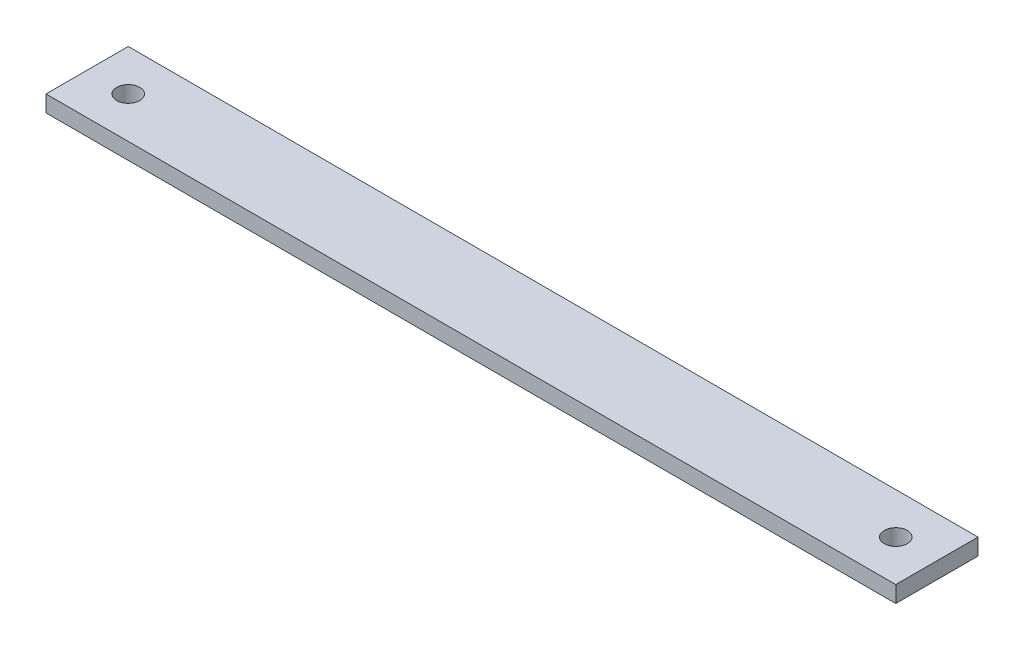
ISO-10303-21;
HEADER;
FILE_DESCRIPTION(('STEP AP214'),'2;1');
FILE_NAME('part.step','',(''),(''),'','','');
FILE_SCHEMA(('AUTOMOTIVE_DESIGN { 1 0 10303 214 1 1 1 1 }'));
ENDSEC;
DATA;
#1=APPLICATION_CONTEXT('core data for automotive mechanical design processes');
#2=APPLICATION_PROTOCOL_DEFINITION('international standard','automotive_design',2000,#1);
#3=PRODUCT_CONTEXT('',#1,'mechanical');
#4=PRODUCT('Part','Part','',(#3));
#5=PRODUCT_RELATED_PRODUCT_CATEGORY('part','',(#4));
#6=PRODUCT_DEFINITION_FORMATION('','',#4);
#7=PRODUCT_DEFINITION_CONTEXT('part definition',#1,'design');
#8=PRODUCT_DEFINITION('design','',#6,#7);
#9=PRODUCT_DEFINITION_SHAPE('','',#8);
#10=(LENGTH_UNIT() NAMED_UNIT(*) SI_UNIT(.MILLI.,.METRE.));
#11=(NAMED_UNIT(*) PLANE_ANGLE_UNIT() SI_UNIT($,.RADIAN.));
#12=(NAMED_UNIT(*) SI_UNIT($,.STERADIAN.) SOLID_ANGLE_UNIT());
#13=UNCERTAINTY_MEASURE_WITH_UNIT(LENGTH_MEASURE(1.E-05),#10,'distance_accuracy_value','');
#14=(GEOMETRIC_REPRESENTATION_CONTEXT(3) GLOBAL_UNCERTAINTY_ASSIGNED_CONTEXT((#13)) GLOBAL_UNIT_ASSIGNED_CONTEXT((#10,
#11,#12)) REPRESENTATION_CONTEXT('',''));
#15=CARTESIAN_POINT('',(0.,0.,0.));
#16=DIRECTION('',(0.,0.,1.));
#17=DIRECTION('',(1.,0.,0.));
#18=AXIS2_PLACEMENT_3D('',#15,#16,#17);
#19=CARTESIAN_POINT('',(-59.4117647058823,3.,-13.3823529411765));
#20=DIRECTION('',(1.,0.,0.));
#21=DIRECTION('',(0.,0.,-1.));
#22=AXIS2_PLACEMENT_3D('',#19,#20,#21);
#23=PLANE('',#22);
#24=DIRECTION('',(0.,0.,1.));
#25=VECTOR('',#24,1.);
#26=CARTESIAN_POINT('',(-59.4117647058823,0.,-13.3823529411765));
#27=LINE('',#26,#25);
#28=CARTESIAN_POINT('',(-59.4117647058823,0.,-13.3823529411765));
#29=VERTEX_POINT('',#28);
#30=CARTESIAN_POINT('',(-59.4117647058824,0.,1.61764705882353));
#31=VERTEX_POINT('',#30);
#32=EDGE_CURVE('E107',#29,#31,#27,.T.);
#33=ORIENTED_EDGE('',*,*,#32,.T.);
#34=DIRECTION('',(0.,-1.,0.));
#35=VECTOR('',#34,1.);
#36=CARTESIAN_POINT('',(-59.4117647058824,3.,1.61764705882353));
#37=LINE('',#36,#35);
#38=CARTESIAN_POINT('',(-59.4117647058824,3.,1.61764705882353));
#39=VERTEX_POINT('',#38);
#40=EDGE_CURVE('E11',#39,#31,#37,.T.);
#41=ORIENTED_EDGE('',*,*,#40,.F.);
#42=DIRECTION('',(0.,0.,1.));
#43=VECTOR('',#42,1.);
#44=CARTESIAN_POINT('',(-59.4117647058823,3.,-13.3823529411765));
#45=LINE('',#44,#43);
#46=CARTESIAN_POINT('',(-59.4117647058823,3.,-13.3823529411765));
#47=VERTEX_POINT('',#46);
#48=EDGE_CURVE('E91',#47,#39,#45,.T.);
#49=ORIENTED_EDGE('',*,*,#48,.F.);
#50=DIRECTION('',(0.,-1.,0.));
#51=VECTOR('',#50,1.);
#52=CARTESIAN_POINT('',(-59.4117647058823,3.,-13.3823529411765));
#53=LINE('',#52,#51);
#54=EDGE_CURVE('E103',#47,#29,#53,.T.);
#55=ORIENTED_EDGE('',*,*,#54,.T.);
#56=EDGE_LOOP('',(#33,#41,#49,#55));
#57=FACE_BOUND('',#56,.T.);
#58=ADVANCED_FACE('F39',(#57),#23,.F.);
#59=CARTESIAN_POINT('',(-59.4117647058824,3.,1.61764705882353));
#60=DIRECTION('',(0.,0.,-1.));
#61=DIRECTION('',(-1.,0.,0.));
#62=AXIS2_PLACEMENT_3D('',#59,#60,#61);
#63=PLANE('',#62);
#64=DIRECTION('',(1.,0.,0.));
#65=VECTOR('',#64,1.);
#66=CARTESIAN_POINT('',(-59.4117647058824,0.,1.61764705882353));
#67=LINE('',#66,#65);
#68=CARTESIAN_POINT('',(95.5882352941176,0.,1.61764705882353));
#69=VERTEX_POINT('',#68);
#70=EDGE_CURVE('E96',#31,#69,#67,.T.);
#71=ORIENTED_EDGE('',*,*,#70,.T.);
#72=DIRECTION('',(0.,-1.,0.));
#73=VECTOR('',#72,1.);
#74=CARTESIAN_POINT('',(95.5882352941176,3.,1.61764705882353));
#75=LINE('',#74,#73);
#76=CARTESIAN_POINT('',(95.5882352941176,3.,1.61764705882353));
#77=VERTEX_POINT('',#76);
#78=EDGE_CURVE('E48',#77,#69,#75,.T.);
#79=ORIENTED_EDGE('',*,*,#78,.F.);
#80=DIRECTION('',(1.,0.,0.));
#81=VECTOR('',#80,1.);
#82=CARTESIAN_POINT('',(-59.4117647058824,3.,1.61764705882353));
#83=LINE('',#82,#81);
#84=EDGE_CURVE('E86',#39,#77,#83,.T.);
#85=ORIENTED_EDGE('',*,*,#84,.F.);
#86=ORIENTED_EDGE('',*,*,#40,.T.);
#87=EDGE_LOOP('',(#71,#79,#85,#86));
#88=FACE_BOUND('',#87,.T.);
#89=ADVANCED_FACE('F95',(#88),#63,.F.);
#90=CARTESIAN_POINT('',(95.5882352941176,3.,-13.3823529411765));
#91=DIRECTION('',(-1.,0.,0.));
#92=DIRECTION('',(0.,0.,1.));
#93=AXIS2_PLACEMENT_3D('',#90,#91,#92);
#94=PLANE('',#93);
#95=DIRECTION('',(0.,0.,-1.));
#96=VECTOR('',#95,1.);
#97=CARTESIAN_POINT('',(95.5882352941176,0.,-13.3823529411765));
#98=LINE('',#97,#96);
#99=CARTESIAN_POINT('',(95.5882352941176,0.,-13.3823529411765));
#100=VERTEX_POINT('',#99);
#101=EDGE_CURVE('E73',#69,#100,#98,.T.);
#102=ORIENTED_EDGE('',*,*,#101,.T.);
#103=DIRECTION('',(0.,-1.,0.));
#104=VECTOR('',#103,1.);
#105=CARTESIAN_POINT('',(95.5882352941176,3.,-13.3823529411765));
#106=LINE('',#105,#104);
#107=CARTESIAN_POINT('',(95.5882352941176,3.,-13.3823529411765));
#108=VERTEX_POINT('',#107);
#109=EDGE_CURVE('E98',#108,#100,#106,.T.);
#110=ORIENTED_EDGE('',*,*,#109,.F.);
#111=DIRECTION('',(0.,0.,-1.));
#112=VECTOR('',#111,1.);
#113=CARTESIAN_POINT('',(95.5882352941176,3.,-13.3823529411765));
#114=LINE('',#113,#112);
#115=EDGE_CURVE('E89',#77,#108,#114,.T.);
#116=ORIENTED_EDGE('',*,*,#115,.F.);
#117=ORIENTED_EDGE('',*,*,#78,.T.);
#118=EDGE_LOOP('',(#102,#110,#116,#117));
#119=FACE_BOUND('',#118,.T.);
#120=ADVANCED_FACE('F99',(#119),#94,.F.);
#121=CARTESIAN_POINT('',(-59.4117647058823,3.,-13.3823529411765));
#122=DIRECTION('',(0.,0.,1.));
#123=DIRECTION('',(1.,0.,0.));
#124=AXIS2_PLACEMENT_3D('',#121,#122,#123);
#125=PLANE('',#124);
#126=DIRECTION('',(-1.,0.,0.));
#127=VECTOR('',#126,1.);
#128=CARTESIAN_POINT('',(-59.4117647058823,0.,-13.3823529411765));
#129=LINE('',#128,#127);
#130=EDGE_CURVE('E79',#100,#29,#129,.T.);
#131=ORIENTED_EDGE('',*,*,#130,.T.);
#132=ORIENTED_EDGE('',*,*,#54,.F.);
#133=DIRECTION('',(-1.,0.,0.));
#134=VECTOR('',#133,1.);
#135=CARTESIAN_POINT('',(-59.4117647058823,3.,-13.3823529411765));
#136=LINE('',#135,#134);
#137=EDGE_CURVE('E56',#108,#47,#136,.T.);
#138=ORIENTED_EDGE('',*,*,#137,.F.);
#139=ORIENTED_EDGE('',*,*,#109,.T.);
#140=EDGE_LOOP('',(#131,#132,#138,#139));
#141=FACE_BOUND('',#140,.T.);
#142=ADVANCED_FACE('F121',(#141),#125,.F.);
#143=CARTESIAN_POINT('',(0.,3.,0.));
#144=DIRECTION('',(0.,1.,0.));
#145=DIRECTION('',(0.,0.,1.));
#146=AXIS2_PLACEMENT_3D('',#143,#144,#145);
#147=PLANE('',#146);
#148=CARTESIAN_POINT('',(-51.9117647058824,3.,-5.88235294117647));
#149=DIRECTION('',(0.,1.,0.));
#150=DIRECTION('',(0.,0.,1.));
#151=AXIS2_PLACEMENT_3D('',#148,#149,#150);
#152=CIRCLE('',#151,2.1);
#153=CARTESIAN_POINT('',(-51.9117647058824,3.,-3.78235294117648));
#154=VERTEX_POINT('',#153);
#155=EDGE_CURVE('E136',#154,#154,#152,.T.);
#156=ORIENTED_EDGE('',*,*,#155,.F.);
#157=EDGE_LOOP('',(#156));
#158=FACE_BOUND('',#157,.T.);
#159=CARTESIAN_POINT('',(88.0882352941176,3.,-5.88235294117647));
#160=DIRECTION('',(0.,1.,0.));
#161=DIRECTION('',(0.,0.,1.));
#162=AXIS2_PLACEMENT_3D('',#159,#160,#161);
#163=CIRCLE('',#162,2.1);
#164=CARTESIAN_POINT('',(88.0882352941176,3.,-3.78235294117647));
#165=VERTEX_POINT('',#164);
#166=EDGE_CURVE('E128',#165,#165,#163,.T.);
#167=ORIENTED_EDGE('',*,*,#166,.F.);
#168=EDGE_LOOP('',(#167));
#169=FACE_BOUND('',#168,.T.);
#170=ORIENTED_EDGE('',*,*,#48,.T.);
#171=ORIENTED_EDGE('',*,*,#84,.T.);
#172=ORIENTED_EDGE('',*,*,#115,.T.);
#173=ORIENTED_EDGE('',*,*,#137,.T.);
#174=EDGE_LOOP('',(#170,#171,#172,#173));
#175=FACE_BOUND('',#174,.T.);
#176=ADVANCED_FACE('F87',(#158,#169,#175),#147,.T.);
#177=CARTESIAN_POINT('',(0.,0.,0.));
#178=DIRECTION('',(0.,1.,0.));
#179=DIRECTION('',(0.,0.,1.));
#180=AXIS2_PLACEMENT_3D('',#177,#178,#179);
#181=PLANE('',#180);
#182=CARTESIAN_POINT('',(-51.9117647058824,0.,-5.88235294117647));
#183=DIRECTION('',(0.,1.,0.));
#184=DIRECTION('',(0.,0.,1.));
#185=AXIS2_PLACEMENT_3D('',#182,#183,#184);
#186=CIRCLE('',#185,2.1);
#187=CARTESIAN_POINT('',(-51.9117647058824,0.,-3.78235294117648));
#188=VERTEX_POINT('',#187);
#189=EDGE_CURVE('E111',#188,#188,#186,.T.);
#190=ORIENTED_EDGE('',*,*,#189,.T.);
#191=EDGE_LOOP('',(#190));
#192=FACE_BOUND('',#191,.T.);
#193=CARTESIAN_POINT('',(88.0882352941176,0.,-5.88235294117647));
#194=DIRECTION('',(0.,1.,0.));
#195=DIRECTION('',(0.,0.,1.));
#196=AXIS2_PLACEMENT_3D('',#193,#194,#195);
#197=CIRCLE('',#196,2.1);
#198=CARTESIAN_POINT('',(88.0882352941176,0.,-3.78235294117647));
#199=VERTEX_POINT('',#198);
#200=EDGE_CURVE('E132',#199,#199,#197,.T.);
#201=ORIENTED_EDGE('',*,*,#200,.T.);
#202=EDGE_LOOP('',(#201));
#203=FACE_BOUND('',#202,.T.);
#204=ORIENTED_EDGE('',*,*,#32,.F.);
#205=ORIENTED_EDGE('',*,*,#130,.F.);
#206=ORIENTED_EDGE('',*,*,#101,.F.);
#207=ORIENTED_EDGE('',*,*,#70,.F.);
#208=EDGE_LOOP('',(#204,#205,#206,#207));
#209=FACE_BOUND('',#208,.T.);
#210=ADVANCED_FACE('F124',(#192,#203,#209),#181,.F.);
#211=CARTESIAN_POINT('',(88.0882352941176,0.,-5.88235294117647));
#212=DIRECTION('',(0.,1.,0.));
#213=DIRECTION('',(0.,0.,1.));
#214=AXIS2_PLACEMENT_3D('',#211,#212,#213);
#215=CYLINDRICAL_SURFACE('',#214,2.1);
#216=ORIENTED_EDGE('',*,*,#200,.F.);
#217=EDGE_LOOP('',(#216));
#218=FACE_BOUND('',#217,.T.);
#219=ORIENTED_EDGE('',*,*,#166,.T.);
#220=EDGE_LOOP('',(#219));
#221=FACE_BOUND('',#220,.T.);
#222=ADVANCED_FACE('F149',(#218,#221),#215,.F.);
#223=CARTESIAN_POINT('',(-51.9117647058824,0.,-5.88235294117647));
#224=DIRECTION('',(0.,1.,0.));
#225=DIRECTION('',(0.,0.,1.));
#226=AXIS2_PLACEMENT_3D('',#223,#224,#225);
#227=CYLINDRICAL_SURFACE('',#226,2.1);
#228=ORIENTED_EDGE('',*,*,#189,.F.);
#229=EDGE_LOOP('',(#228));
#230=FACE_BOUND('',#229,.T.);
#231=ORIENTED_EDGE('',*,*,#155,.T.);
#232=EDGE_LOOP('',(#231));
#233=FACE_BOUND('',#232,.T.);
#234=ADVANCED_FACE('F146',(#230,#233),#227,.F.);
#235=CLOSED_SHELL('',(#58,#89,#120,#142,#176,#210,#222,#234));
#236=MANIFOLD_SOLID_BREP('B2',#235);
#237=ADVANCED_BREP_SHAPE_REPRESENTATION('',(#18,#236),#14);
#238=SHAPE_DEFINITION_REPRESENTATION(#9,#237);
ENDSEC;
END-ISO-10303-21;
